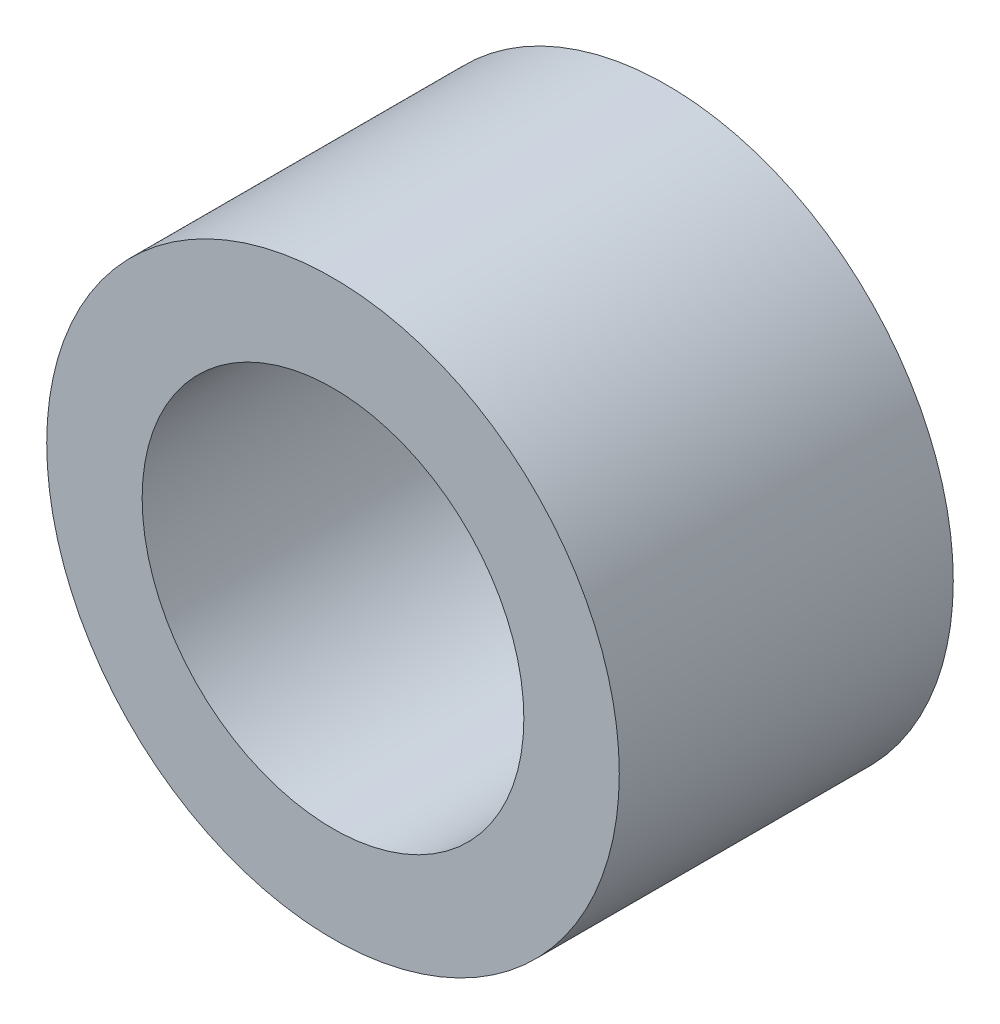
ISO-10303-21;
HEADER;
FILE_DESCRIPTION(('STEP AP214'),'2;1');
FILE_NAME('part.step','',(''),(''),'','','');
FILE_SCHEMA(('AUTOMOTIVE_DESIGN { 1 0 10303 214 1 1 1 1 }'));
ENDSEC;
DATA;
#1=APPLICATION_CONTEXT('core data for automotive mechanical design processes');
#2=APPLICATION_PROTOCOL_DEFINITION('international standard','automotive_design',2000,#1);
#3=PRODUCT_CONTEXT('',#1,'mechanical');
#4=PRODUCT('Part','Part','',(#3));
#5=PRODUCT_RELATED_PRODUCT_CATEGORY('part','',(#4));
#6=PRODUCT_DEFINITION_FORMATION('','',#4);
#7=PRODUCT_DEFINITION_CONTEXT('part definition',#1,'design');
#8=PRODUCT_DEFINITION('design','',#6,#7);
#9=PRODUCT_DEFINITION_SHAPE('','',#8);
#10=(LENGTH_UNIT() NAMED_UNIT(*) SI_UNIT(.MILLI.,.METRE.));
#11=(NAMED_UNIT(*) PLANE_ANGLE_UNIT() SI_UNIT($,.RADIAN.));
#12=(NAMED_UNIT(*) SI_UNIT($,.STERADIAN.) SOLID_ANGLE_UNIT());
#13=UNCERTAINTY_MEASURE_WITH_UNIT(LENGTH_MEASURE(1.E-05),#10,'distance_accuracy_value','');
#14=(GEOMETRIC_REPRESENTATION_CONTEXT(3) GLOBAL_UNCERTAINTY_ASSIGNED_CONTEXT((#13)) GLOBAL_UNIT_ASSIGNED_CONTEXT((#10,
#11,#12)) REPRESENTATION_CONTEXT('',''));
#15=CARTESIAN_POINT('',(0.,0.,0.));
#16=DIRECTION('',(0.,0.,1.));
#17=DIRECTION('',(1.,0.,0.));
#18=AXIS2_PLACEMENT_3D('',#15,#16,#17);
#19=CARTESIAN_POINT('',(0.,0.,-8.75));
#20=DIRECTION('',(0.,0.,1.));
#21=DIRECTION('',(1.,0.,0.));
#22=AXIS2_PLACEMENT_3D('',#19,#20,#21);
#23=CYLINDRICAL_SURFACE('',#22,7.5);
#24=CARTESIAN_POINT('',(0.,0.,-8.75));
#25=DIRECTION('',(0.,0.,1.));
#26=DIRECTION('',(1.,0.,0.));
#27=AXIS2_PLACEMENT_3D('',#24,#25,#26);
#28=CIRCLE('',#27,7.5);
#29=CARTESIAN_POINT('',(7.5,0.,-8.75));
#30=VERTEX_POINT('',#29);
#31=EDGE_CURVE('E10',#30,#30,#28,.T.);
#32=ORIENTED_EDGE('',*,*,#31,.T.);
#33=EDGE_LOOP('',(#32));
#34=FACE_BOUND('',#33,.T.);
#35=CARTESIAN_POINT('',(0.,0.,0.));
#36=DIRECTION('',(0.,0.,1.));
#37=DIRECTION('',(1.,0.,0.));
#38=AXIS2_PLACEMENT_3D('',#35,#36,#37);
#39=CIRCLE('',#38,7.5);
#40=CARTESIAN_POINT('',(7.5,0.,0.));
#41=VERTEX_POINT('',#40);
#42=EDGE_CURVE('E39',#41,#41,#39,.T.);
#43=ORIENTED_EDGE('',*,*,#42,.F.);
#44=EDGE_LOOP('',(#43));
#45=FACE_BOUND('',#44,.T.);
#46=ADVANCED_FACE('F36',(#34,#45),#23,.T.);
#47=CARTESIAN_POINT('',(0.,0.,-8.75));
#48=DIRECTION('',(0.,0.,1.));
#49=DIRECTION('',(1.,0.,0.));
#50=AXIS2_PLACEMENT_3D('',#47,#48,#49);
#51=PLANE('',#50);
#52=CARTESIAN_POINT('',(0.,0.,-8.75));
#53=DIRECTION('',(0.,0.,1.));
#54=DIRECTION('',(1.,0.,0.));
#55=AXIS2_PLACEMENT_3D('',#52,#53,#54);
#56=CIRCLE('',#55,5.);
#57=CARTESIAN_POINT('',(5.,0.,-8.75));
#58=VERTEX_POINT('',#57);
#59=EDGE_CURVE('E48',#58,#58,#56,.T.);
#60=ORIENTED_EDGE('',*,*,#59,.T.);
#61=EDGE_LOOP('',(#60));
#62=FACE_BOUND('',#61,.T.);
#63=ORIENTED_EDGE('',*,*,#31,.F.);
#64=EDGE_LOOP('',(#63));
#65=FACE_BOUND('',#64,.T.);
#66=ADVANCED_FACE('F58',(#62,#65),#51,.F.);
#67=CARTESIAN_POINT('',(0.,0.,0.));
#68=DIRECTION('',(0.,0.,1.));
#69=DIRECTION('',(1.,0.,0.));
#70=AXIS2_PLACEMENT_3D('',#67,#68,#69);
#71=PLANE('',#70);
#72=CARTESIAN_POINT('',(0.,0.,0.));
#73=DIRECTION('',(0.,0.,1.));
#74=DIRECTION('',(1.,0.,0.));
#75=AXIS2_PLACEMENT_3D('',#72,#73,#74);
#76=CIRCLE('',#75,5.);
#77=CARTESIAN_POINT('',(5.,0.,0.));
#78=VERTEX_POINT('',#77);
#79=EDGE_CURVE('E50',#78,#78,#76,.T.);
#80=ORIENTED_EDGE('',*,*,#79,.F.);
#81=EDGE_LOOP('',(#80));
#82=FACE_BOUND('',#81,.T.);
#83=ORIENTED_EDGE('',*,*,#42,.T.);
#84=EDGE_LOOP('',(#83));
#85=FACE_BOUND('',#84,.T.);
#86=ADVANCED_FACE('F64',(#82,#85),#71,.T.);
#87=CARTESIAN_POINT('',(0.,0.,-8.75));
#88=DIRECTION('',(0.,0.,1.));
#89=DIRECTION('',(1.,0.,0.));
#90=AXIS2_PLACEMENT_3D('',#87,#88,#89);
#91=CYLINDRICAL_SURFACE('',#90,5.);
#92=ORIENTED_EDGE('',*,*,#59,.F.);
#93=EDGE_LOOP('',(#92));
#94=FACE_BOUND('',#93,.T.);
#95=ORIENTED_EDGE('',*,*,#79,.T.);
#96=EDGE_LOOP('',(#95));
#97=FACE_BOUND('',#96,.T.);
#98=ADVANCED_FACE('F61',(#94,#97),#91,.F.);
#99=CLOSED_SHELL('',(#46,#66,#86,#98));
#100=MANIFOLD_SOLID_BREP('B2',#99);
#101=ADVANCED_BREP_SHAPE_REPRESENTATION('',(#18,#100),#14);
#102=SHAPE_DEFINITION_REPRESENTATION(#9,#101);
ENDSEC;
END-ISO-10303-21;
